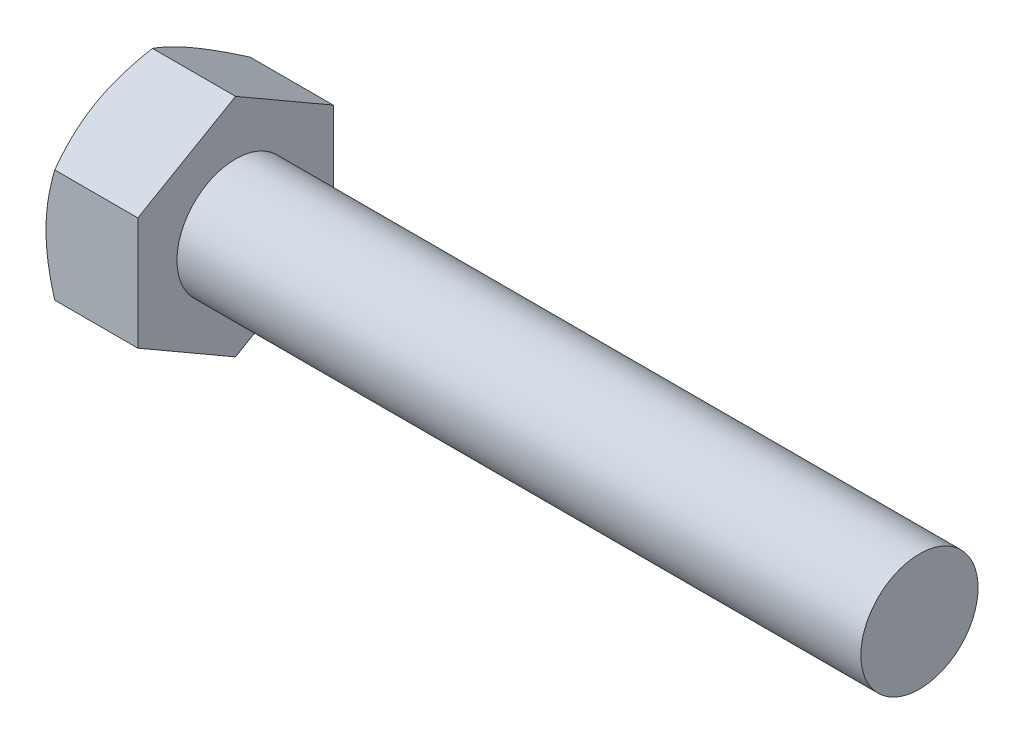
ISO-10303-21;
HEADER;
FILE_DESCRIPTION(('STEP AP214'),'2;1');
FILE_NAME('part.step','',(''),(''),'','','');
FILE_SCHEMA(('AUTOMOTIVE_DESIGN { 1 0 10303 214 1 1 1 1 }'));
ENDSEC;
DATA;
#1=APPLICATION_CONTEXT('core data for automotive mechanical design processes');
#2=APPLICATION_PROTOCOL_DEFINITION('international standard','automotive_design',2000,#1);
#3=PRODUCT_CONTEXT('',#1,'mechanical');
#4=PRODUCT('Part','Part','',(#3));
#5=PRODUCT_RELATED_PRODUCT_CATEGORY('part','',(#4));
#6=PRODUCT_DEFINITION_FORMATION('','',#4);
#7=PRODUCT_DEFINITION_CONTEXT('part definition',#1,'design');
#8=PRODUCT_DEFINITION('design','',#6,#7);
#9=PRODUCT_DEFINITION_SHAPE('','',#8);
#10=(LENGTH_UNIT() NAMED_UNIT(*) SI_UNIT(.MILLI.,.METRE.));
#11=(NAMED_UNIT(*) PLANE_ANGLE_UNIT() SI_UNIT($,.RADIAN.));
#12=(NAMED_UNIT(*) SI_UNIT($,.STERADIAN.) SOLID_ANGLE_UNIT());
#13=UNCERTAINTY_MEASURE_WITH_UNIT(LENGTH_MEASURE(1.E-05),#10,'distance_accuracy_value','');
#14=(GEOMETRIC_REPRESENTATION_CONTEXT(3) GLOBAL_UNCERTAINTY_ASSIGNED_CONTEXT((#13)) GLOBAL_UNIT_ASSIGNED_CONTEXT((#10,
#11,#12)) REPRESENTATION_CONTEXT('',''));
#15=CARTESIAN_POINT('',(0.,0.,0.));
#16=DIRECTION('',(0.,0.,1.));
#17=DIRECTION('',(1.,0.,0.));
#18=AXIS2_PLACEMENT_3D('',#15,#16,#17);
#19=CARTESIAN_POINT('',(0.5875,0.,0.));
#20=DIRECTION('',(1.,0.,0.));
#21=DIRECTION('',(0.,0.,-1.));
#22=AXIS2_PLACEMENT_3D('',#19,#20,#21);
#23=PLANE('',#22);
#24=CARTESIAN_POINT('',(0.5875,0.,0.));
#25=DIRECTION('',(-1.,0.,0.));
#26=DIRECTION('',(0.,0.,1.));
#27=AXIS2_PLACEMENT_3D('',#24,#25,#26);
#28=CIRCLE('',#27,4.375);
#29=CARTESIAN_POINT('',(0.5875,0.,4.375));
#30=VERTEX_POINT('',#29);
#31=EDGE_CURVE('E20',#30,#30,#28,.T.);
#32=ORIENTED_EDGE('',*,*,#31,.T.);
#33=EDGE_LOOP('',(#32));
#34=FACE_BOUND('',#33,.T.);
#35=ADVANCED_FACE('F17',(#34),#23,.F.);
#36=CARTESIAN_POINT('',(0.5875,0.,0.));
#37=DIRECTION('',(-1.,0.,0.));
#38=DIRECTION('',(0.,0.,1.));
#39=AXIS2_PLACEMENT_3D('',#36,#37,#38);
#40=CYLINDRICAL_SURFACE('',#39,4.375);
#41=ORIENTED_EDGE('',*,*,#31,.F.);
#42=EDGE_LOOP('',(#41));
#43=FACE_BOUND('',#42,.T.);
#44=CARTESIAN_POINT('',(0.,0.,0.));
#45=DIRECTION('',(-1.,0.,0.));
#46=DIRECTION('',(0.,0.,1.));
#47=AXIS2_PLACEMENT_3D('',#44,#45,#46);
#48=CIRCLE('',#47,4.375);
#49=CARTESIAN_POINT('',(0.,0.,4.375));
#50=VERTEX_POINT('',#49);
#51=EDGE_CURVE('E95',#50,#50,#48,.F.);
#52=ORIENTED_EDGE('',*,*,#51,.F.);
#53=EDGE_LOOP('',(#52));
#54=FACE_BOUND('',#53,.T.);
#55=ADVANCED_FACE('F313',(#43,#54),#40,.F.);
#56=CARTESIAN_POINT('',(0.,0.,0.));
#57=DIRECTION('',(-1.,0.,0.));
#58=DIRECTION('',(0.,0.,1.));
#59=AXIS2_PLACEMENT_3D('',#56,#57,#58);
#60=PLANE('',#59);
#61=ORIENTED_EDGE('',*,*,#51,.T.);
#62=EDGE_LOOP('',(#61));
#63=FACE_BOUND('',#62,.T.);
#64=CARTESIAN_POINT('',(7.105427357601E-09,0.,0.));
#65=DIRECTION('',(1.,0.,0.));
#66=DIRECTION('',(0.,1.,0.));
#67=AXIS2_PLACEMENT_3D('',#64,#65,#66);
#68=CIRCLE('',#67,5.00000001227363);
#69=CARTESIAN_POINT('',(4.74013797408259E-09,-4.33012702838319,2.50000001638704));
#70=VERTEX_POINT('',#69);
#71=CARTESIAN_POINT('',(8.27623444650628E-09,-4.33012702660206,-2.5000000153587));
#72=VERTEX_POINT('',#71);
#73=EDGE_CURVE('E300',#70,#72,#68,.T.);
#74=ORIENTED_EDGE('',*,*,#73,.F.);
#75=CARTESIAN_POINT('',(0.,0.,0.));
#76=DIRECTION('',(1.,0.,0.));
#77=DIRECTION('',(0.,0.,-1.));
#78=AXIS2_PLACEMENT_3D('',#75,#76,#77);
#79=CIRCLE('',#78,4.99999999999545);
#80=CARTESIAN_POINT('',(3.54440478703144E-09,0.,4.99999999999773));
#81=VERTEX_POINT('',#80);
#82=EDGE_CURVE('E442',#81,#70,#79,.T.);
#83=ORIENTED_EDGE('',*,*,#82,.F.);
#84=CARTESIAN_POINT('',(7.08880962827299E-09,0.,0.));
#85=DIRECTION('',(1.,0.,0.));
#86=DIRECTION('',(0.,0.,-1.));
#87=AXIS2_PLACEMENT_3D('',#84,#85,#86);
#88=CIRCLE('',#87,5.00000001227363);
#89=CARTESIAN_POINT('',(8.27629759967718E-09,4.33012702660215,2.50000001535876));
#90=VERTEX_POINT('',#89);
#91=EDGE_CURVE('E91',#90,#81,#88,.T.);
#92=ORIENTED_EDGE('',*,*,#91,.F.);
#93=CARTESIAN_POINT('',(7.105427357601E-09,0.,0.));
#94=DIRECTION('',(1.,0.,0.));
#95=DIRECTION('',(0.,1.,0.));
#96=AXIS2_PLACEMENT_3D('',#93,#94,#95);
#97=CIRCLE('',#96,5.00000001227363);
#98=CARTESIAN_POINT('',(4.74020206694736E-09,4.33012702838339,-2.50000001638716));
#99=VERTEX_POINT('',#98);
#100=EDGE_CURVE('E85',#99,#90,#97,.T.);
#101=ORIENTED_EDGE('',*,*,#100,.F.);
#102=CARTESIAN_POINT('',(0.,0.,0.));
#103=DIRECTION('',(1.,0.,0.));
#104=DIRECTION('',(0.,0.,-1.));
#105=AXIS2_PLACEMENT_3D('',#102,#103,#104);
#106=CIRCLE('',#105,4.99999999999545);
#107=CARTESIAN_POINT('',(3.54440503097693E-09,0.,-4.99999999999773));
#108=VERTEX_POINT('',#107);
#109=EDGE_CURVE('E88',#108,#99,#106,.T.);
#110=ORIENTED_EDGE('',*,*,#109,.F.);
#111=CARTESIAN_POINT('',(7.08881011616397E-09,0.,0.));
#112=DIRECTION('',(1.,0.,0.));
#113=DIRECTION('',(0.,0.,-1.));
#114=AXIS2_PLACEMENT_3D('',#111,#112,#113);
#115=CIRCLE('',#114,5.00000001227363);
#116=EDGE_CURVE('E106',#72,#108,#115,.T.);
#117=ORIENTED_EDGE('',*,*,#116,.F.);
#118=EDGE_LOOP('',(#74,#83,#92,#101,#110,#117));
#119=FACE_BOUND('',#118,.T.);
#120=ADVANCED_FACE('F87',(#63,#119),#60,.T.);
#121=CARTESIAN_POINT('',(0.449261493940867,0.,0.));
#122=DIRECTION('',(1.,0.,0.));
#123=DIRECTION('',(0.,1.,0.));
#124=AXIS2_PLACEMENT_3D('',#121,#122,#123);
#125=CONICAL_SURFACE('',#124,5.77814373338015,1.04719755120973);
#126=CARTESIAN_POINT('',(9.3302412713324E-09,4.33012702860863,-2.5000000165172));
#127=CARTESIAN_POINT('',(-2.04253876693156E-05,4.39139022924448,-2.39388904051192));
#128=CARTESIAN_POINT('',(0.00259979996646305,4.45265047870994,-2.28778317628033));
#129=CARTESIAN_POINT('',(0.0129696889106451,4.57505069234628,-2.07577978823127));
#130=CARTESIAN_POINT('',(0.0207183370339177,4.63619067792704,-1.96988222733075));
#131=CARTESIAN_POINT('',(0.0411421651140095,4.75795544791058,-1.75897946009567));
#132=CARTESIAN_POINT('',(0.0537925438077502,4.81858128030084,-1.6539724385938));
#133=CARTESIAN_POINT('',(0.0837477185240878,4.93954410264598,-1.4444586853733));
#134=CARTESIAN_POINT('',(0.1010526370577,4.99988108495556,-1.33995196689674));
#135=CARTESIAN_POINT('',(0.159414607944622,5.18020865494931,-1.02761545503101));
#136=CARTESIAN_POINT('',(0.206947214517581,5.29967538428081,-0.820693010917681));
#137=CARTESIAN_POINT('',(0.316569562845942,5.53758148152701,-0.408627564854847));
#138=CARTESIAN_POINT('',(0.378732005448972,5.65601255106241,-0.203498936119839));
#139=CARTESIAN_POINT('',(0.446582001956851,5.77350271712522,-1.31635812572207E-12));
#140=B_SPLINE_CURVE_WITH_KNOTS('',3,(#126,#127,#128,#129,#130,#131,#132,#133,#134,#135,#136,
#137,#138,#139),.UNSPECIFIED.,.F.,.F.,(4,2,2,2,2,2,4),(0.,0.367541691354156,0.73501062841745,
1.10064406492518,1.46628712612392,2.19661490580317,2.93065156989514),.UNSPECIFIED.);
#141=CARTESIAN_POINT('',(0.44658200195707,5.7735027171256,6.55986501807624E-13));
#142=VERTEX_POINT('',#141);
#143=EDGE_CURVE('E109',#99,#142,#140,.T.);
#144=ORIENTED_EDGE('',*,*,#143,.F.);
#145=ORIENTED_EDGE('',*,*,#100,.T.);
#146=CARTESIAN_POINT('',(0.446582001956851,5.77350271712522,1.3134253081652E-12));
#147=CARTESIAN_POINT('',(0.378732005444531,5.65601255105726,0.203498936131459));
#148=CARTESIAN_POINT('',(0.316569562838844,5.53758148151482,0.408627564877299));
#149=CARTESIAN_POINT('',(0.206947214507334,5.29967538425538,0.820693010960386));
#150=CARTESIAN_POINT('',(0.159414607933761,5.18020865491769,1.02761545508311));
#151=CARTESIAN_POINT('',(0.101052637045332,4.99988108491638,1.33995196696594));
#152=CARTESIAN_POINT('',(0.083747718511046,4.93954410260415,1.44445868544943));
#153=CARTESIAN_POINT('',(0.0537925437975043,4.81858128024865,1.65397243868053));
#154=CARTESIAN_POINT('',(0.0411421651072186,4.75795544785068,1.7589794601861));
#155=CARTESIAN_POINT('',(0.0207183370212629,4.63619067787114,1.96988222744097));
#156=CARTESIAN_POINT('',(0.0129696888886609,4.57505069230219,2.07577978835766));
#157=CARTESIAN_POINT('',(0.00259979997654583,4.45265047861339,2.28778317639752));
#158=CARTESIAN_POINT('',(-2.04253361358098E-05,4.39139022908363,2.39388904060373));
#159=CARTESIAN_POINT('',(9.48040358935866E-09,4.33012702829776,2.50000001653546));
#160=B_SPLINE_CURVE_WITH_KNOTS('',3,(#146,#147,#148,#149,#150,#151,#152,#153,#154,#155,#156,
#157,#158,#159),.UNSPECIFIED.,.F.,.F.,(4,2,2,2,2,2,4),(0.,0.734036664131566,1.46436444384436,
1.83000750506485,2.19564094159321,2.56310987868116,2.93065157006315),.UNSPECIFIED.);
#161=EDGE_CURVE('E112',#142,#90,#160,.T.);
#162=ORIENTED_EDGE('',*,*,#161,.F.);
#163=EDGE_LOOP('',(#144,#145,#162));
#164=FACE_BOUND('',#163,.T.);
#165=ADVANCED_FACE('F110',(#164),#125,.T.);
#166=CARTESIAN_POINT('',(0.449261482970087,0.,0.));
#167=DIRECTION('',(1.,0.,0.));
#168=DIRECTION('',(0.,0.,-1.));
#169=AXIS2_PLACEMENT_3D('',#166,#167,#168);
#170=CONICAL_SURFACE('',#169,5.7781437143376,1.04719755117112);
#171=CARTESIAN_POINT('',(2.62627876890996E-12,0.,-5.));
#172=CARTESIAN_POINT('',(-2.04348114201907E-05,0.122526400761559,-5.));
#173=CARTESIAN_POINT('',(0.00259979049502686,0.245046899010865,-5.));
#174=CARTESIAN_POINT('',(0.012969679377677,0.489847324769537,-5.));
#175=CARTESIAN_POINT('',(0.0207183274870519,0.612127295098708,-5.));
#176=CARTESIAN_POINT('',(0.0411421555101738,0.855656833447012,-5.));
#177=CARTESIAN_POINT('',(0.0537925341609349,0.976908497440895,-5.));
#178=CARTESIAN_POINT('',(0.0837477087799371,1.2188341405515,-5.));
#179=CARTESIAN_POINT('',(0.101052627259208,1.33950810437762,-5.));
#180=CARTESIAN_POINT('',(0.159414597961098,1.7001632419941,-5.));
#181=CARTESIAN_POINT('',(0.206947204381568,1.93909669908845,-5.));
#182=CARTESIAN_POINT('',(0.316569552358383,2.41490889045852,-5.));
#183=CARTESIAN_POINT('',(0.378731994762238,2.65177102797574,-5.));
#184=CARTESIAN_POINT('',(0.446581991053766,2.88675135855628,-5.));
#185=B_SPLINE_CURVE_WITH_KNOTS('',3,(#171,#172,#173,#174,#175,#176,#177,#178,#179,#180,#181,
#182,#183,#184),.UNSPECIFIED.,.F.,.F.,(4,2,2,2,2,2,4),(0.,0.367541690156254,0.735010626018702,
1.10064406132765,1.4662871213287,2.19661489860577,2.93065156028933),.UNSPECIFIED.);
#186=CARTESIAN_POINT('',(0.446581991054608,2.88675135856498,-4.99999999999667));
#187=VERTEX_POINT('',#186);
#188=EDGE_CURVE('E104',#108,#187,#185,.T.);
#189=ORIENTED_EDGE('',*,*,#188,.F.);
#190=ORIENTED_EDGE('',*,*,#109,.T.);
#191=CARTESIAN_POINT('',(0.446581991050269,2.88675135857106,-4.99999999999681));
#192=CARTESIAN_POINT('',(0.378731996062227,3.00424152313926,-4.79650106645737));
#193=CARTESIAN_POINT('',(0.31656955490855,3.12267259116002,-4.59137244034441));
#194=CARTESIAN_POINT('',(0.20694720920085,3.36057868534821,-4.17930699957895));
#195=CARTESIAN_POINT('',(0.159414603801787,3.48004541313672,-3.97238455814026));
#196=CARTESIAN_POINT('',(0.101052634388756,3.66037298077315,-3.66004805035379));
#197=CARTESIAN_POINT('',(0.0837477162990157,3.72070996228813,-3.55554133325112));
#198=CARTESIAN_POINT('',(0.0537925423615911,3.8416727830386,-3.34602758279997));
#199=CARTESIAN_POINT('',(0.0411421640028897,3.90229861462877,-3.24102056269356));
#200=CARTESIAN_POINT('',(0.0207183364558775,4.0240633829749,-3.03011779826784));
#201=CARTESIAN_POINT('',(0.0129696885295381,4.08520336771818,-2.92422023878127));
#202=CARTESIAN_POINT('',(0.0025997998933054,4.20760357975054,-2.71221685361044));
#203=CARTESIAN_POINT('',(-2.04253498373253E-05,4.26886382844952,-2.60611099084316));
#204=CARTESIAN_POINT('',(9.46378660161487E-09,4.33012702840446,-2.50000001635065));
#205=B_SPLINE_CURVE_WITH_KNOTS('',3,(#191,#192,#193,#194,#195,#196,#197,#198,#199,#200,#201,
#202,#203,#204),.UNSPECIFIED.,.F.,.F.,(4,2,2,2,2,2,4),(0.,0.734036654219953,1.46436442414071,
1.83000748043996,2.19564091204796,2.56310984415688,2.930651530555),.UNSPECIFIED.);
#206=EDGE_CURVE('E101',#187,#99,#205,.T.);
#207=ORIENTED_EDGE('',*,*,#206,.F.);
#208=EDGE_LOOP('',(#189,#190,#207));
#209=FACE_BOUND('',#208,.T.);
#210=ADVANCED_FACE('F99',(#209),#170,.T.);
#211=CARTESIAN_POINT('',(0.449261482970087,0.,0.));
#212=DIRECTION('',(1.,0.,0.));
#213=DIRECTION('',(0.,0.,-1.));
#214=AXIS2_PLACEMENT_3D('',#211,#212,#213);
#215=CONICAL_SURFACE('',#214,5.7781437143376,1.04719755117112);
#216=CARTESIAN_POINT('',(8.87459446228538E-09,-4.33012702926679,-2.50000001689719));
#217=CARTESIAN_POINT('',(-2.04255610583987E-05,-4.26886382875445,-2.60611099104729));
#218=CARTESIAN_POINT('',(0.0025997998369295,-4.20760357982974,-2.71221685366911));
#219=CARTESIAN_POINT('',(0.0129696885858378,-4.08520336763634,-2.92422023872629));
#220=CARTESIAN_POINT('',(0.0207183364702197,-4.02406338295769,-3.03011779824464));
#221=CARTESIAN_POINT('',(0.0411421639859496,-3.90229861465992,-3.24102056269147));
#222=CARTESIAN_POINT('',(0.0537925423552588,-3.84167278305389,-3.34602758278745));
#223=CARTESIAN_POINT('',(0.0837477163001017,-3.72070996229263,-3.55554133322847));
#224=CARTESIAN_POINT('',(0.101052634386596,-3.66037298078271,-3.66004805033146));
#225=CARTESIAN_POINT('',(0.159414603794993,-3.48004541315023,-3.97238455812705));
#226=CARTESIAN_POINT('',(0.206947209196613,-3.36057868535577,-4.1793069995716));
#227=CARTESIAN_POINT('',(0.316569554909922,-3.12267259115778,-4.5913724403416));
#228=CARTESIAN_POINT('',(0.378731996066246,-3.00424152313312,-4.79650106645329));
#229=CARTESIAN_POINT('',(0.446581991053691,-2.88675135856618,-4.99999999999414));
#230=B_SPLINE_CURVE_WITH_KNOTS('',3,(#216,#217,#218,#219,#220,#221,#222,#223,#224,#225,#226,
#227,#228,#229),.UNSPECIFIED.,.F.,.F.,(4,2,2,2,2,2,4),(0.,0.367541686368647,0.735010618460503,
1.10064405006579,1.46628710635791,2.19661487630298,2.93065153052634),.UNSPECIFIED.);
#231=CARTESIAN_POINT('',(0.446581991054534,-2.88675135855895,-5.));
#232=VERTEX_POINT('',#231);
#233=EDGE_CURVE('E182',#72,#232,#230,.T.);
#234=ORIENTED_EDGE('',*,*,#233,.F.);
#235=ORIENTED_EDGE('',*,*,#116,.T.);
#236=CARTESIAN_POINT('',(0.446581991050195,-2.88675135855603,-5.00000000000534));
#237=CARTESIAN_POINT('',(0.378731994760841,-2.65177102797506,-5.00000000000187));
#238=CARTESIAN_POINT('',(0.316569552357877,-2.41490889045775,-5.00000000000049));
#239=CARTESIAN_POINT('',(0.206947204381737,-1.93909669908776,-4.99999999999952));
#240=CARTESIAN_POINT('',(0.159414597961059,-1.70016324199358,-4.99999999999991));
#241=CARTESIAN_POINT('',(0.101052627259123,-1.33950810437724,-5.00000000000005));
#242=CARTESIAN_POINT('',(0.0837477087798806,-1.21883414055115,-5.00000000000001));
#243=CARTESIAN_POINT('',(0.0537925341609079,-0.976908497440582,-4.99999999999999));
#244=CARTESIAN_POINT('',(0.0411421555101482,-0.855656833446722,-5.));
#245=CARTESIAN_POINT('',(0.0207183274870347,-0.612127295098481,-5.));
#246=CARTESIAN_POINT('',(0.0129696793776662,-0.489847324769351,-5.));
#247=CARTESIAN_POINT('',(0.00259979049502578,-0.245046899010768,-5.));
#248=CARTESIAN_POINT('',(-2.04348114182146E-05,-0.12252640076151,-5.));
#249=CARTESIAN_POINT('',(2.62626741345266E-12,0.,-5.));
#250=B_SPLINE_CURVE_WITH_KNOTS('',3,(#236,#237,#238,#239,#240,#241,#242,#243,#244,#245,#246,
#247,#248,#249),.UNSPECIFIED.,.F.,.F.,(4,2,2,2,2,2,4),(0.,0.734036661683138,1.4643644389599,
1.83000749896087,2.19564093426975,2.56310987013207,2.93065156028818),.UNSPECIFIED.);
#251=EDGE_CURVE('E158',#232,#108,#250,.T.);
#252=ORIENTED_EDGE('',*,*,#251,.F.);
#253=EDGE_LOOP('',(#234,#235,#252));
#254=FACE_BOUND('',#253,.T.);
#255=ADVANCED_FACE('F146',(#254),#215,.T.);
#256=CARTESIAN_POINT('',(0.449261493940867,0.,0.));
#257=DIRECTION('',(1.,0.,0.));
#258=DIRECTION('',(0.,1.,0.));
#259=AXIS2_PLACEMENT_3D('',#256,#257,#258);
#260=CONICAL_SURFACE('',#259,5.77814373338015,1.04719755120973);
#261=CARTESIAN_POINT('',(0.446582001956703,-5.77350271712496,-1.31531325710197E-12));
#262=CARTESIAN_POINT('',(0.378732005444387,-5.65601255105701,-0.203498936131452));
#263=CARTESIAN_POINT('',(0.316569562838703,-5.53758148151457,-0.408627564877282));
#264=CARTESIAN_POINT('',(0.206947214507198,-5.29967538425514,-0.820693010960351));
#265=CARTESIAN_POINT('',(0.159414607933627,-5.18020865491746,-1.02761545508307));
#266=CARTESIAN_POINT('',(0.1010526370452,-4.99988108491615,-1.33995196696589));
#267=CARTESIAN_POINT('',(0.0837477185109151,-4.93954410260393,-1.44445868544936));
#268=CARTESIAN_POINT('',(0.0537925437973746,-4.81858128024843,-1.65397243868046));
#269=CARTESIAN_POINT('',(0.0411421651070894,-4.75795544785047,-1.75897946018602));
#270=CARTESIAN_POINT('',(0.0207183370211346,-4.63619067787094,-1.96988222744088));
#271=CARTESIAN_POINT('',(0.0129696888885332,-4.57505069230199,-2.07577978835757));
#272=CARTESIAN_POINT('',(0.00259979997641868,-4.45265047861319,-2.28778317639742));
#273=CARTESIAN_POINT('',(-2.0425336262845E-05,-4.39139022908344,-2.39388904060362));
#274=CARTESIAN_POINT('',(9.48027626220135E-09,-4.33012702829757,-2.50000001653535));
#275=B_SPLINE_CURVE_WITH_KNOTS('',3,(#261,#262,#263,#264,#265,#266,#267,#268,#269,#270,#271,
#272,#273,#274),.UNSPECIFIED.,.F.,.F.,(4,2,2,2,2,2,4),(0.,0.734036664131533,1.4643644438443,
1.83000750506477,2.19564094159311,2.56310987868105,2.93065157006302),.UNSPECIFIED.);
#276=CARTESIAN_POINT('',(0.446582001956923,-5.77350271712534,-6.58451484210205E-13));
#277=VERTEX_POINT('',#276);
#278=EDGE_CURVE('E159',#277,#72,#275,.T.);
#279=ORIENTED_EDGE('',*,*,#278,.F.);
#280=CARTESIAN_POINT('',(9.33010851606264E-09,-4.33012702860845,2.50000001651709));
#281=CARTESIAN_POINT('',(-2.04253877988549E-05,-4.39139022924429,2.39388904051182));
#282=CARTESIAN_POINT('',(0.00259979996633456,-4.45265047870974,2.28778317628023));
#283=CARTESIAN_POINT('',(0.0129696889105168,-4.57505069234607,2.07577978823117));
#284=CARTESIAN_POINT('',(0.0207183370337886,-4.63619067792683,1.96988222733066));
#285=CARTESIAN_POINT('',(0.0411421651138791,-4.75795544791037,1.7589794600956));
#286=CARTESIAN_POINT('',(0.0537925438076195,-4.81858128030063,1.65397243859372));
#287=CARTESIAN_POINT('',(0.0837477185239558,-4.93954410264576,1.44445868537323));
#288=CARTESIAN_POINT('',(0.101052637057567,-4.99988108495534,1.33995196689668));
#289=CARTESIAN_POINT('',(0.159414607944487,-5.18020865494908,1.02761545503096));
#290=CARTESIAN_POINT('',(0.206947214517443,-5.29967538428057,0.820693010917643));
#291=CARTESIAN_POINT('',(0.3165695628458,-5.53758148152676,0.408627564854827));
#292=CARTESIAN_POINT('',(0.378732005448828,-5.65601255106216,0.203498936119828));
#293=CARTESIAN_POINT('',(0.446582001956703,-5.77350271712496,1.31416272979037E-12));
#294=B_SPLINE_CURVE_WITH_KNOTS('',3,(#280,#281,#282,#283,#284,#285,#286,#287,#288,#289,#290,
#291,#292,#293),.UNSPECIFIED.,.F.,.F.,(4,2,2,2,2,2,4),(0.,0.367541691354139,0.735010628417417,
1.10064406492513,1.46628712612385,2.19661490580308,2.93065156989501),.UNSPECIFIED.);
#295=EDGE_CURVE('E196',#70,#277,#294,.T.);
#296=ORIENTED_EDGE('',*,*,#295,.F.);
#297=ORIENTED_EDGE('',*,*,#73,.T.);
#298=EDGE_LOOP('',(#279,#296,#297));
#299=FACE_BOUND('',#298,.T.);
#300=ADVANCED_FACE('F299',(#299),#260,.T.);
#301=CARTESIAN_POINT('',(0.449261482970087,0.,0.));
#302=DIRECTION('',(1.,0.,0.));
#303=DIRECTION('',(0.,0.,-1.));
#304=AXIS2_PLACEMENT_3D('',#301,#302,#303);
#305=CONICAL_SURFACE('',#304,5.7781437143376,1.04719755117112);
#306=CARTESIAN_POINT('',(0.446581991050268,2.88675135855628,5.00000000000534));
#307=CARTESIAN_POINT('',(0.378731994760903,2.65177102797529,5.00000000000186));
#308=CARTESIAN_POINT('',(0.316569552357929,2.41490889045797,5.00000000000049));
#309=CARTESIAN_POINT('',(0.206947204381771,1.93909669908793,4.99999999999951));
#310=CARTESIAN_POINT('',(0.159414597961085,1.70016324199373,4.99999999999991));
#311=CARTESIAN_POINT('',(0.101052627259139,1.33950810437736,5.00000000000004));
#312=CARTESIAN_POINT('',(0.083747708779894,1.21883414055126,5.00000000000001));
#313=CARTESIAN_POINT('',(0.0537925341609161,0.976908497440671,4.99999999999999));
#314=CARTESIAN_POINT('',(0.0411421555101543,0.8556568334468,5.));
#315=CARTESIAN_POINT('',(0.0207183274870373,0.612127295098537,5.));
#316=CARTESIAN_POINT('',(0.0129696793776675,0.489847324769396,5.));
#317=CARTESIAN_POINT('',(0.00259979049502534,0.245046899010791,5.));
#318=CARTESIAN_POINT('',(-2.04348114191293E-05,0.122526400761522,5.));
#319=CARTESIAN_POINT('',(2.62527479671719E-12,0.,5.));
#320=B_SPLINE_CURVE_WITH_KNOTS('',3,(#306,#307,#308,#309,#310,#311,#312,#313,#314,#315,#316,
#317,#318,#319),.UNSPECIFIED.,.F.,.F.,(4,2,2,2,2,2,4),(0.,0.734036661683205,1.46436443896003,
1.83000749896103,2.19564093426994,2.5631098701323,2.93065156028844),.UNSPECIFIED.);
#321=CARTESIAN_POINT('',(0.446581991053495,2.88675135856113,4.99999999999666));
#322=VERTEX_POINT('',#321);
#323=EDGE_CURVE('E218',#322,#81,#320,.T.);
#324=ORIENTED_EDGE('',*,*,#323,.F.);
#325=CARTESIAN_POINT('',(8.87472601384773E-09,4.33012702926697,2.5000000168973));
#326=CARTESIAN_POINT('',(-2.04255609293523E-05,4.26886382875464,2.6061109910474));
#327=CARTESIAN_POINT('',(0.00259979983705694,4.20760357982994,2.71221685366921));
#328=CARTESIAN_POINT('',(0.0129696885859627,4.08520336763655,2.92422023872638));
#329=CARTESIAN_POINT('',(0.0207183364703437,4.0240633829579,3.03011779824472));
#330=CARTESIAN_POINT('',(0.0411421639860712,3.90229861466013,3.24102056269155));
#331=CARTESIAN_POINT('',(0.053792542355379,3.8416727830541,3.34602758278752));
#332=CARTESIAN_POINT('',(0.083747716300218,3.72070996229285,3.55554133322854));
#333=CARTESIAN_POINT('',(0.10105263438671,3.66037298078294,3.66004805033152));
#334=CARTESIAN_POINT('',(0.159414603795099,3.48004541315046,3.97238455812709));
#335=CARTESIAN_POINT('',(0.206947209196713,3.36057868535601,4.17930699957164));
#336=CARTESIAN_POINT('',(0.316569554910009,3.12267259115803,4.59137244034162));
#337=CARTESIAN_POINT('',(0.378731996066326,3.00424152313337,4.7965010664533));
#338=CARTESIAN_POINT('',(0.446581991053763,2.88675135856644,4.99999999999414));
#339=B_SPLINE_CURVE_WITH_KNOTS('',3,(#325,#326,#327,#328,#329,#330,#331,#332,#333,#334,#335,
#336,#337,#338),.UNSPECIFIED.,.F.,.F.,(4,2,2,2,2,2,4),(0.,0.367541686368629,0.735010618460469,
1.10064405006574,1.46628710635784,2.19661487630288,2.9306515305262),.UNSPECIFIED.);
#340=EDGE_CURVE('E122',#90,#322,#339,.T.);
#341=ORIENTED_EDGE('',*,*,#340,.F.);
#342=ORIENTED_EDGE('',*,*,#91,.T.);
#343=EDGE_LOOP('',(#324,#341,#342));
#344=FACE_BOUND('',#343,.T.);
#345=ADVANCED_FACE('F205',(#344),#305,.T.);
#346=CARTESIAN_POINT('',(0.449261482970087,0.,0.));
#347=DIRECTION('',(1.,0.,0.));
#348=DIRECTION('',(0.,0.,-1.));
#349=AXIS2_PLACEMENT_3D('',#346,#347,#348);
#350=CONICAL_SURFACE('',#349,5.7781437143376,1.04719755117112);
#351=CARTESIAN_POINT('',(0.446581991050195,-2.88675135857081,4.99999999999681));
#352=CARTESIAN_POINT('',(0.378731996062146,-3.00424152313901,4.79650106645737));
#353=CARTESIAN_POINT('',(0.316569554908463,-3.12267259115977,4.5913724403444));
#354=CARTESIAN_POINT('',(0.206947209200749,-3.36057868534797,4.17930699957891));
#355=CARTESIAN_POINT('',(0.15941460380168,-3.48004541313649,3.97238455814022));
#356=CARTESIAN_POINT('',(0.101052634388641,-3.66037298077293,3.66004805035374));
#357=CARTESIAN_POINT('',(0.0837477162988987,-3.72070996228791,3.55554133325106));
#358=CARTESIAN_POINT('',(0.0537925423614704,-3.84167278303838,3.3460275827999));
#359=CARTESIAN_POINT('',(0.0411421640027674,-3.90229861462856,3.24102056269348));
#360=CARTESIAN_POINT('',(0.0207183364557523,-4.0240633829747,3.03011779826776));
#361=CARTESIAN_POINT('',(0.0129696885294115,-4.08520336771797,2.92422023878117));
#362=CARTESIAN_POINT('',(0.00259979989317704,-4.20760357975034,2.71221685361034));
#363=CARTESIAN_POINT('',(-2.04253499660503E-05,-4.26886382844933,2.60611099084305));
#364=CARTESIAN_POINT('',(9.46365837798261E-09,-4.33012702840427,2.50000001635054));
#365=B_SPLINE_CURVE_WITH_KNOTS('',3,(#351,#352,#353,#354,#355,#356,#357,#358,#359,#360,#361,
#362,#363,#364),.UNSPECIFIED.,.F.,.F.,(4,2,2,2,2,2,4),(0.,0.734036654219988,1.46436442414078,
1.83000748044005,2.19564091204806,2.563109844157,2.93065153055514),.UNSPECIFIED.);
#366=CARTESIAN_POINT('',(0.446581991054534,-2.88675135856472,4.99999999999667));
#367=VERTEX_POINT('',#366);
#368=EDGE_CURVE('E189',#367,#70,#365,.T.);
#369=ORIENTED_EDGE('',*,*,#368,.F.);
#370=CARTESIAN_POINT('',(2.62528205605233E-12,0.,5.));
#371=CARTESIAN_POINT('',(-2.0434811421342E-05,-0.122526400761546,5.));
#372=CARTESIAN_POINT('',(0.0025997904950253,-0.245046899010842,5.));
#373=CARTESIAN_POINT('',(0.0129696793776738,-0.489847324769492,5.));
#374=CARTESIAN_POINT('',(0.0207183274870474,-0.612127295098652,5.));
#375=CARTESIAN_POINT('',(0.0411421555101656,-0.855656833446934,5.));
#376=CARTESIAN_POINT('',(0.0537925341609241,-0.976908497440807,5.));
#377=CARTESIAN_POINT('',(0.0837477087799211,-1.21883414055139,5.));
#378=CARTESIAN_POINT('',(0.101052627259189,-1.3395081043775,5.));
#379=CARTESIAN_POINT('',(0.15941459796107,-1.70016324199395,5.));
#380=CARTESIAN_POINT('',(0.206947204381532,-1.93909669908828,5.));
#381=CARTESIAN_POINT('',(0.316569552358329,-2.41490889045831,5.));
#382=CARTESIAN_POINT('',(0.378731994762174,-2.6517710279755,5.));
#383=CARTESIAN_POINT('',(0.446581991053691,-2.88675135855603,5.));
#384=B_SPLINE_CURVE_WITH_KNOTS('',3,(#370,#371,#372,#373,#374,#375,#376,#377,#378,#379,#380,
#381,#382,#383),.UNSPECIFIED.,.F.,.F.,(4,2,2,2,2,2,4),(0.,0.367541690156221,0.735010626018636,
1.10064406132755,1.46628712132856,2.19661489860557,2.93065156028906),.UNSPECIFIED.);
#385=EDGE_CURVE('E211',#81,#367,#384,.T.);
#386=ORIENTED_EDGE('',*,*,#385,.F.);
#387=ORIENTED_EDGE('',*,*,#82,.T.);
#388=EDGE_LOOP('',(#369,#386,#387));
#389=FACE_BOUND('',#388,.T.);
#390=ADVANCED_FACE('F201',(#389),#350,.T.);
#391=CARTESIAN_POINT('',(4.7,2.88675135856305,5.));
#392=DIRECTION('',(0.,0.866025402838329,0.50000000163871));
#393=DIRECTION('',(0.,-0.50000000163871,0.866025402838329));
#394=AXIS2_PLACEMENT_3D('',#391,#392,#393);
#395=PLANE('',#394);
#396=ORIENTED_EDGE('',*,*,#161,.T.);
#397=ORIENTED_EDGE('',*,*,#340,.T.);
#398=DIRECTION('',(1.,0.,0.));
#399=VECTOR('',#398,1.);
#400=CARTESIAN_POINT('',(4.7,2.88675135856305,5.));
#401=LINE('',#400,#399);
#402=CARTESIAN_POINT('',(4.7,2.88675135856305,5.));
#403=VERTEX_POINT('',#402);
#404=EDGE_CURVE('E449',#403,#322,#401,.F.);
#405=ORIENTED_EDGE('',*,*,#404,.F.);
#406=DIRECTION('',(0.,0.50000000163871,-0.866025402838329));
#407=VECTOR('',#406,1.);
#408=CARTESIAN_POINT('',(4.7,2.88675135856305,5.));
#409=LINE('',#408,#407);
#410=CARTESIAN_POINT('',(4.7,5.77350271712598,0.));
#411=VERTEX_POINT('',#410);
#412=EDGE_CURVE('E217',#403,#411,#409,.T.);
#413=ORIENTED_EDGE('',*,*,#412,.T.);
#414=DIRECTION('',(1.,0.,0.));
#415=VECTOR('',#414,1.);
#416=CARTESIAN_POINT('',(4.7,5.77350271712598,0.));
#417=LINE('',#416,#415);
#418=EDGE_CURVE('E120',#142,#411,#417,.T.);
#419=ORIENTED_EDGE('',*,*,#418,.F.);
#420=EDGE_LOOP('',(#396,#397,#405,#413,#419));
#421=FACE_BOUND('',#420,.T.);
#422=ADVANCED_FACE('F204',(#421),#395,.T.);
#423=CARTESIAN_POINT('',(4.7,5.77350271712598,0.));
#424=DIRECTION('',(0.,0.866025402838329,-0.50000000163871));
#425=DIRECTION('',(0.,0.50000000163871,0.866025402838329));
#426=AXIS2_PLACEMENT_3D('',#423,#424,#425);
#427=PLANE('',#426);
#428=ORIENTED_EDGE('',*,*,#206,.T.);
#429=ORIENTED_EDGE('',*,*,#143,.T.);
#430=ORIENTED_EDGE('',*,*,#418,.T.);
#431=DIRECTION('',(0.,-0.50000000163871,-0.866025402838329));
#432=VECTOR('',#431,1.);
#433=CARTESIAN_POINT('',(4.7,5.77350271712598,0.));
#434=LINE('',#433,#432);
#435=CARTESIAN_POINT('',(4.7,2.88675135856305,-5.));
#436=VERTEX_POINT('',#435);
#437=EDGE_CURVE('E260',#411,#436,#434,.T.);
#438=ORIENTED_EDGE('',*,*,#437,.T.);
#439=DIRECTION('',(1.,0.,0.));
#440=VECTOR('',#439,1.);
#441=CARTESIAN_POINT('',(4.7,2.88675135856305,-5.));
#442=LINE('',#441,#440);
#443=EDGE_CURVE('E116',#187,#436,#442,.T.);
#444=ORIENTED_EDGE('',*,*,#443,.F.);
#445=EDGE_LOOP('',(#428,#429,#430,#438,#444));
#446=FACE_BOUND('',#445,.T.);
#447=ADVANCED_FACE('F118',(#446),#427,.T.);
#448=CARTESIAN_POINT('',(4.7,2.88675135856305,-5.));
#449=DIRECTION('',(0.,0.,-1.));
#450=DIRECTION('',(0.,1.,0.));
#451=AXIS2_PLACEMENT_3D('',#448,#449,#450);
#452=PLANE('',#451);
#453=ORIENTED_EDGE('',*,*,#251,.T.);
#454=ORIENTED_EDGE('',*,*,#188,.T.);
#455=ORIENTED_EDGE('',*,*,#443,.T.);
#456=DIRECTION('',(0.,1.,0.));
#457=VECTOR('',#456,1.);
#458=CARTESIAN_POINT('',(4.7,3.,-5.));
#459=LINE('',#458,#457);
#460=CARTESIAN_POINT('',(4.7,-2.8867513585628,-5.));
#461=VERTEX_POINT('',#460);
#462=EDGE_CURVE('E266',#436,#461,#459,.F.);
#463=ORIENTED_EDGE('',*,*,#462,.T.);
#464=DIRECTION('',(1.,0.,0.));
#465=VECTOR('',#464,1.);
#466=CARTESIAN_POINT('',(4.7,-2.8867513585628,-5.));
#467=LINE('',#466,#465);
#468=EDGE_CURVE('E157',#232,#461,#467,.T.);
#469=ORIENTED_EDGE('',*,*,#468,.F.);
#470=EDGE_LOOP('',(#453,#454,#455,#463,#469));
#471=FACE_BOUND('',#470,.T.);
#472=ADVANCED_FACE('F168',(#471),#452,.T.);
#473=CARTESIAN_POINT('',(4.7,-2.8867513585628,-5.));
#474=DIRECTION('',(0.,-0.866025402838329,-0.50000000163871));
#475=DIRECTION('',(0.,0.50000000163871,-0.866025402838329));
#476=AXIS2_PLACEMENT_3D('',#473,#474,#475);
#477=PLANE('',#476);
#478=ORIENTED_EDGE('',*,*,#278,.T.);
#479=ORIENTED_EDGE('',*,*,#233,.T.);
#480=ORIENTED_EDGE('',*,*,#468,.T.);
#481=DIRECTION('',(0.,-0.50000000163871,0.866025402838329));
#482=VECTOR('',#481,1.);
#483=CARTESIAN_POINT('',(4.7,-2.8867513585628,-5.));
#484=LINE('',#483,#482);
#485=CARTESIAN_POINT('',(4.7,-5.77350271712572,0.));
#486=VERTEX_POINT('',#485);
#487=EDGE_CURVE('E252',#461,#486,#484,.T.);
#488=ORIENTED_EDGE('',*,*,#487,.T.);
#489=DIRECTION('',(1.,0.,0.));
#490=VECTOR('',#489,1.);
#491=CARTESIAN_POINT('',(4.7,-5.77350271712572,0.));
#492=LINE('',#491,#490);
#493=EDGE_CURVE('E188',#277,#486,#492,.T.);
#494=ORIENTED_EDGE('',*,*,#493,.F.);
#495=EDGE_LOOP('',(#478,#479,#480,#488,#494));
#496=FACE_BOUND('',#495,.T.);
#497=ADVANCED_FACE('F171',(#496),#477,.T.);
#498=CARTESIAN_POINT('',(4.7,-5.77350271712572,0.));
#499=DIRECTION('',(0.,-0.866025402838329,0.50000000163871));
#500=DIRECTION('',(0.,-0.50000000163871,-0.866025402838329));
#501=AXIS2_PLACEMENT_3D('',#498,#499,#500);
#502=PLANE('',#501);
#503=ORIENTED_EDGE('',*,*,#368,.T.);
#504=ORIENTED_EDGE('',*,*,#295,.T.);
#505=ORIENTED_EDGE('',*,*,#493,.T.);
#506=DIRECTION('',(0.,0.50000000163871,0.866025402838329));
#507=VECTOR('',#506,1.);
#508=CARTESIAN_POINT('',(4.7,-5.77350271712572,0.));
#509=LINE('',#508,#507);
#510=CARTESIAN_POINT('',(4.7,-2.8867513585628,5.));
#511=VERTEX_POINT('',#510);
#512=EDGE_CURVE('E35',#486,#511,#509,.T.);
#513=ORIENTED_EDGE('',*,*,#512,.T.);
#514=DIRECTION('',(1.,0.,0.));
#515=VECTOR('',#514,1.);
#516=CARTESIAN_POINT('',(4.7,-2.8867513585628,5.));
#517=LINE('',#516,#515);
#518=EDGE_CURVE('E450',#367,#511,#517,.T.);
#519=ORIENTED_EDGE('',*,*,#518,.F.);
#520=EDGE_LOOP('',(#503,#504,#505,#513,#519));
#521=FACE_BOUND('',#520,.T.);
#522=ADVANCED_FACE('F177',(#521),#502,.T.);
#523=CARTESIAN_POINT('',(4.7,-2.8867513585628,5.));
#524=DIRECTION('',(0.,0.,1.));
#525=DIRECTION('',(0.,-1.,0.));
#526=AXIS2_PLACEMENT_3D('',#523,#524,#525);
#527=PLANE('',#526);
#528=ORIENTED_EDGE('',*,*,#323,.T.);
#529=ORIENTED_EDGE('',*,*,#385,.T.);
#530=ORIENTED_EDGE('',*,*,#518,.T.);
#531=DIRECTION('',(0.,1.,0.));
#532=VECTOR('',#531,1.);
#533=CARTESIAN_POINT('',(4.7,3.,5.));
#534=LINE('',#533,#532);
#535=EDGE_CURVE('E246',#511,#403,#534,.T.);
#536=ORIENTED_EDGE('',*,*,#535,.T.);
#537=ORIENTED_EDGE('',*,*,#404,.T.);
#538=EDGE_LOOP('',(#528,#529,#530,#536,#537));
#539=FACE_BOUND('',#538,.T.);
#540=ADVANCED_FACE('F222',(#539),#527,.T.);
#541=CARTESIAN_POINT('',(39.7,3.,0.));
#542=DIRECTION('',(1.,0.,0.));
#543=DIRECTION('',(0.,0.,-1.));
#544=AXIS2_PLACEMENT_3D('',#541,#542,#543);
#545=PLANE('',#544);
#546=CARTESIAN_POINT('',(39.7,0.,0.));
#547=DIRECTION('',(-1.,0.,0.));
#548=DIRECTION('',(0.,0.,1.));
#549=AXIS2_PLACEMENT_3D('',#546,#547,#548);
#550=CIRCLE('',#549,3.);
#551=CARTESIAN_POINT('',(39.7,0.,3.));
#552=VERTEX_POINT('',#551);
#553=EDGE_CURVE('E26',#552,#552,#550,.T.);
#554=ORIENTED_EDGE('',*,*,#553,.F.);
#555=EDGE_LOOP('',(#554));
#556=FACE_BOUND('',#555,.T.);
#557=ADVANCED_FACE('F226',(#556),#545,.T.);
#558=CARTESIAN_POINT('',(4.7,3.,0.));
#559=DIRECTION('',(-1.,0.,0.));
#560=DIRECTION('',(0.,0.,1.));
#561=AXIS2_PLACEMENT_3D('',#558,#559,#560);
#562=PLANE('',#561);
#563=ORIENTED_EDGE('',*,*,#512,.F.);
#564=ORIENTED_EDGE('',*,*,#487,.F.);
#565=ORIENTED_EDGE('',*,*,#462,.F.);
#566=ORIENTED_EDGE('',*,*,#437,.F.);
#567=ORIENTED_EDGE('',*,*,#412,.F.);
#568=ORIENTED_EDGE('',*,*,#535,.F.);
#569=EDGE_LOOP('',(#563,#564,#565,#566,#567,#568));
#570=FACE_BOUND('',#569,.T.);
#571=CARTESIAN_POINT('',(4.7,0.,0.));
#572=DIRECTION('',(-1.,0.,0.));
#573=DIRECTION('',(0.,0.,1.));
#574=AXIS2_PLACEMENT_3D('',#571,#572,#573);
#575=CIRCLE('',#574,3.);
#576=CARTESIAN_POINT('',(4.7,0.,3.));
#577=VERTEX_POINT('',#576);
#578=EDGE_CURVE('E11',#577,#577,#575,.F.);
#579=ORIENTED_EDGE('',*,*,#578,.F.);
#580=EDGE_LOOP('',(#579));
#581=FACE_BOUND('',#580,.T.);
#582=ADVANCED_FACE('F231',(#570,#581),#562,.F.);
#583=CARTESIAN_POINT('',(-25.4,0.,0.));
#584=DIRECTION('',(-1.,0.,0.));
#585=DIRECTION('',(0.,0.,1.));
#586=AXIS2_PLACEMENT_3D('',#583,#584,#585);
#587=CYLINDRICAL_SURFACE('',#586,3.);
#588=ORIENTED_EDGE('',*,*,#578,.T.);
#589=EDGE_LOOP('',(#588));
#590=FACE_BOUND('',#589,.T.);
#591=ORIENTED_EDGE('',*,*,#553,.T.);
#592=EDGE_LOOP('',(#591));
#593=FACE_BOUND('',#592,.T.);
#594=ADVANCED_FACE('F235',(#590,#593),#587,.T.);
#595=CLOSED_SHELL('',(#35,#55,#120,#165,#210,#255,#300,#345,#390,#422,#447,#472,#497,#522,#540,
#557,#582,#594));
#596=MANIFOLD_SOLID_BREP('B1',#595);
#597=ADVANCED_BREP_SHAPE_REPRESENTATION('',(#18,#596),#14);
#598=SHAPE_DEFINITION_REPRESENTATION(#9,#597);
ENDSEC;
END-ISO-10303-21;
